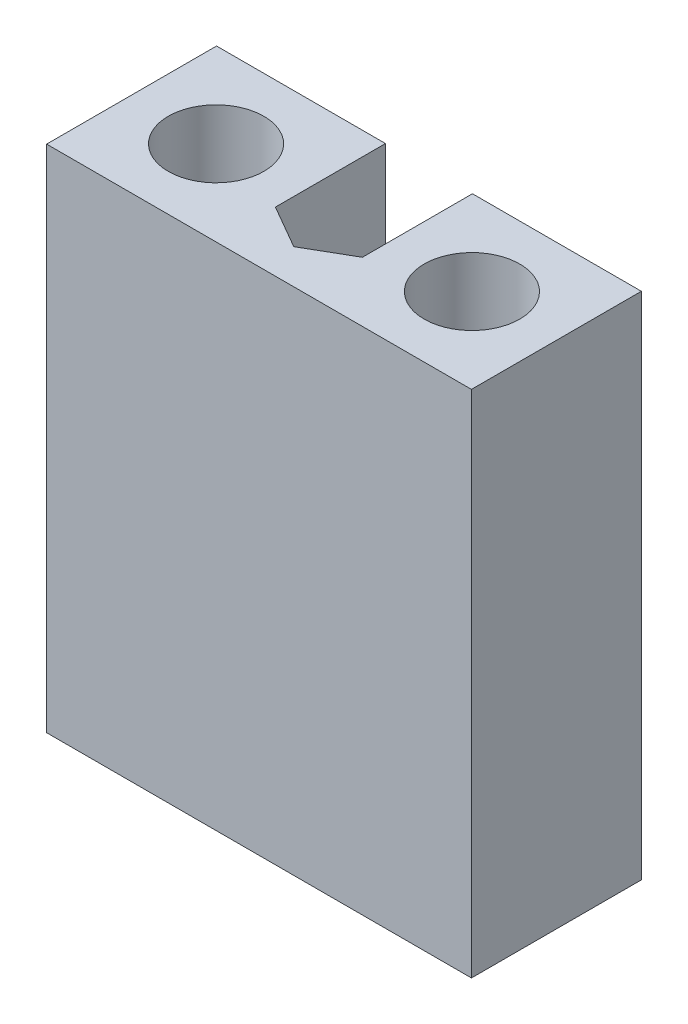
ISO-10303-21;
HEADER;
FILE_DESCRIPTION(('STEP AP214'),'2;1');
FILE_NAME('part.step','',(''),(''),'','','');
FILE_SCHEMA(('AUTOMOTIVE_DESIGN { 1 0 10303 214 1 1 1 1 }'));
ENDSEC;
DATA;
#1=APPLICATION_CONTEXT('core data for automotive mechanical design processes');
#2=APPLICATION_PROTOCOL_DEFINITION('international standard','automotive_design',2000,#1);
#3=PRODUCT_CONTEXT('',#1,'mechanical');
#4=PRODUCT('Part','Part','',(#3));
#5=PRODUCT_RELATED_PRODUCT_CATEGORY('part','',(#4));
#6=PRODUCT_DEFINITION_FORMATION('','',#4);
#7=PRODUCT_DEFINITION_CONTEXT('part definition',#1,'design');
#8=PRODUCT_DEFINITION('design','',#6,#7);
#9=PRODUCT_DEFINITION_SHAPE('','',#8);
#10=(LENGTH_UNIT() NAMED_UNIT(*) SI_UNIT(.MILLI.,.METRE.));
#11=(NAMED_UNIT(*) PLANE_ANGLE_UNIT() SI_UNIT($,.RADIAN.));
#12=(NAMED_UNIT(*) SI_UNIT($,.STERADIAN.) SOLID_ANGLE_UNIT());
#13=UNCERTAINTY_MEASURE_WITH_UNIT(LENGTH_MEASURE(1.E-05),#10,'distance_accuracy_value','');
#14=(GEOMETRIC_REPRESENTATION_CONTEXT(3) GLOBAL_UNCERTAINTY_ASSIGNED_CONTEXT((#13)) GLOBAL_UNIT_ASSIGNED_CONTEXT((#10,
#11,#12)) REPRESENTATION_CONTEXT('',''));
#15=CARTESIAN_POINT('',(0.,0.,0.));
#16=DIRECTION('',(0.,0.,1.));
#17=DIRECTION('',(1.,0.,0.));
#18=AXIS2_PLACEMENT_3D('',#15,#16,#17);
#19=CARTESIAN_POINT('',(0.,76.2,0.));
#20=DIRECTION('',(0.,-1.,0.));
#21=DIRECTION('',(0.,0.,-1.));
#22=AXIS2_PLACEMENT_3D('',#19,#20,#21);
#23=PLANE('',#22);
#24=CARTESIAN_POINT('',(19.125,76.2,0.));
#25=DIRECTION('',(0.,1.,0.));
#26=DIRECTION('',(0.,0.,1.));
#27=AXIS2_PLACEMENT_3D('',#24,#25,#26);
#28=CIRCLE('',#27,7.14375);
#29=CARTESIAN_POINT('',(19.125,76.2,7.14375));
#30=VERTEX_POINT('',#29);
#31=EDGE_CURVE('E238',#30,#30,#28,.T.);
#32=ORIENTED_EDGE('',*,*,#31,.F.);
#33=EDGE_LOOP('',(#32));
#34=FACE_BOUND('',#33,.T.);
#35=DIRECTION('',(-1.,0.,0.));
#36=VECTOR('',#35,1.);
#37=CARTESIAN_POINT('',(6.5,76.2,-12.7));
#38=LINE('',#37,#36);
#39=CARTESIAN_POINT('',(31.75,76.2,-12.7));
#40=VERTEX_POINT('',#39);
#41=CARTESIAN_POINT('',(6.5,76.2,-12.7));
#42=VERTEX_POINT('',#41);
#43=EDGE_CURVE('E174',#40,#42,#38,.T.);
#44=ORIENTED_EDGE('',*,*,#43,.T.);
#45=DIRECTION('',(0.,0.,1.));
#46=VECTOR('',#45,1.);
#47=CARTESIAN_POINT('',(6.5,76.2,-3.75277674973257));
#48=LINE('',#47,#46);
#49=CARTESIAN_POINT('',(6.5,76.2,3.75277674973257));
#50=VERTEX_POINT('',#49);
#51=EDGE_CURVE('E103',#42,#50,#48,.T.);
#52=ORIENTED_EDGE('',*,*,#51,.T.);
#53=DIRECTION('',(-0.866025403784439,0.,0.5));
#54=VECTOR('',#53,1.);
#55=CARTESIAN_POINT('',(0.,76.2,7.50555349946514));
#56=LINE('',#55,#54);
#57=CARTESIAN_POINT('',(0.,76.2,7.50555349946514));
#58=VERTEX_POINT('',#57);
#59=EDGE_CURVE('E199',#50,#58,#56,.T.);
#60=ORIENTED_EDGE('',*,*,#59,.T.);
#61=DIRECTION('',(-0.866025403784439,0.,-0.5));
#62=VECTOR('',#61,1.);
#63=CARTESIAN_POINT('',(-6.5,76.2,3.75277674973257));
#64=LINE('',#63,#62);
#65=CARTESIAN_POINT('',(-6.5,76.2,3.75277674973257));
#66=VERTEX_POINT('',#65);
#67=EDGE_CURVE('E215',#58,#66,#64,.T.);
#68=ORIENTED_EDGE('',*,*,#67,.T.);
#69=DIRECTION('',(0.,0.,-1.));
#70=VECTOR('',#69,1.);
#71=CARTESIAN_POINT('',(-6.5,76.2,-3.75277674973257));
#72=LINE('',#71,#70);
#73=CARTESIAN_POINT('',(-6.5,76.2,-12.7));
#74=VERTEX_POINT('',#73);
#75=EDGE_CURVE('E213',#66,#74,#72,.T.);
#76=ORIENTED_EDGE('',*,*,#75,.T.);
#77=DIRECTION('',(-1.,0.,0.));
#78=VECTOR('',#77,1.);
#79=CARTESIAN_POINT('',(-31.75,76.2,-12.7));
#80=LINE('',#79,#78);
#81=CARTESIAN_POINT('',(-31.75,76.2,-12.7));
#82=VERTEX_POINT('',#81);
#83=EDGE_CURVE('E125',#74,#82,#80,.T.);
#84=ORIENTED_EDGE('',*,*,#83,.T.);
#85=DIRECTION('',(0.,0.,1.));
#86=VECTOR('',#85,1.);
#87=CARTESIAN_POINT('',(-31.75,76.2,12.7));
#88=LINE('',#87,#86);
#89=CARTESIAN_POINT('',(-31.75,76.2,12.7));
#90=VERTEX_POINT('',#89);
#91=EDGE_CURVE('E119',#82,#90,#88,.T.);
#92=ORIENTED_EDGE('',*,*,#91,.T.);
#93=DIRECTION('',(1.,0.,0.));
#94=VECTOR('',#93,1.);
#95=CARTESIAN_POINT('',(31.75,76.2,12.7));
#96=LINE('',#95,#94);
#97=CARTESIAN_POINT('',(31.75,76.2,12.7));
#98=VERTEX_POINT('',#97);
#99=EDGE_CURVE('E123',#90,#98,#96,.T.);
#100=ORIENTED_EDGE('',*,*,#99,.T.);
#101=DIRECTION('',(0.,0.,-1.));
#102=VECTOR('',#101,1.);
#103=CARTESIAN_POINT('',(31.75,76.2,-12.7));
#104=LINE('',#103,#102);
#105=EDGE_CURVE('E57',#98,#40,#104,.T.);
#106=ORIENTED_EDGE('',*,*,#105,.T.);
#107=EDGE_LOOP('',(#44,#52,#60,#68,#76,#84,#92,#100,#106));
#108=FACE_BOUND('',#107,.T.);
#109=CARTESIAN_POINT('',(-19.125,76.2,0.));
#110=DIRECTION('',(0.,1.,0.));
#111=DIRECTION('',(0.,0.,1.));
#112=AXIS2_PLACEMENT_3D('',#109,#110,#111);
#113=CIRCLE('',#112,7.14375);
#114=CARTESIAN_POINT('',(-19.125,76.2,7.14375));
#115=VERTEX_POINT('',#114);
#116=EDGE_CURVE('E254',#115,#115,#113,.T.);
#117=ORIENTED_EDGE('',*,*,#116,.F.);
#118=EDGE_LOOP('',(#117));
#119=FACE_BOUND('',#118,.T.);
#120=ADVANCED_FACE('F39',(#34,#108,#119),#23,.F.);
#121=CARTESIAN_POINT('',(6.5,76.2,-12.7));
#122=DIRECTION('',(0.,0.,1.));
#123=DIRECTION('',(1.,0.,0.));
#124=AXIS2_PLACEMENT_3D('',#121,#122,#123);
#125=PLANE('',#124);
#126=DIRECTION('',(-1.,0.,0.));
#127=VECTOR('',#126,1.);
#128=CARTESIAN_POINT('',(6.5,0.,-12.7));
#129=LINE('',#128,#127);
#130=CARTESIAN_POINT('',(31.75,0.,-12.7));
#131=VERTEX_POINT('',#130);
#132=CARTESIAN_POINT('',(6.5,0.,-12.7));
#133=VERTEX_POINT('',#132);
#134=EDGE_CURVE('E147',#131,#133,#129,.T.);
#135=ORIENTED_EDGE('',*,*,#134,.T.);
#136=DIRECTION('',(0.,-1.,0.));
#137=VECTOR('',#136,1.);
#138=CARTESIAN_POINT('',(6.5,76.2,-12.7));
#139=LINE('',#138,#137);
#140=EDGE_CURVE('E11',#42,#133,#139,.T.);
#141=ORIENTED_EDGE('',*,*,#140,.F.);
#142=ORIENTED_EDGE('',*,*,#43,.F.);
#143=DIRECTION('',(0.,-1.,0.));
#144=VECTOR('',#143,1.);
#145=CARTESIAN_POINT('',(31.75,76.2,-12.7));
#146=LINE('',#145,#144);
#147=EDGE_CURVE('E143',#40,#131,#146,.T.);
#148=ORIENTED_EDGE('',*,*,#147,.T.);
#149=EDGE_LOOP('',(#135,#141,#142,#148));
#150=FACE_BOUND('',#149,.T.);
#151=ADVANCED_FACE('F41',(#150),#125,.F.);
#152=CARTESIAN_POINT('',(6.5,76.2,3.75277674973257));
#153=DIRECTION('',(1.,0.,0.));
#154=DIRECTION('',(0.,0.,-1.));
#155=AXIS2_PLACEMENT_3D('',#152,#153,#154);
#156=PLANE('',#155);
#157=DIRECTION('',(0.,0.,1.));
#158=VECTOR('',#157,1.);
#159=CARTESIAN_POINT('',(6.5,0.,3.75277674973257));
#160=LINE('',#159,#158);
#161=CARTESIAN_POINT('',(6.5,0.,3.75277674973257));
#162=VERTEX_POINT('',#161);
#163=EDGE_CURVE('E151',#133,#162,#160,.T.);
#164=ORIENTED_EDGE('',*,*,#163,.T.);
#165=DIRECTION('',(0.,-1.,0.));
#166=VECTOR('',#165,1.);
#167=CARTESIAN_POINT('',(6.5,76.2,3.75277674973257));
#168=LINE('',#167,#166);
#169=EDGE_CURVE('E49',#50,#162,#168,.T.);
#170=ORIENTED_EDGE('',*,*,#169,.F.);
#171=ORIENTED_EDGE('',*,*,#51,.F.);
#172=ORIENTED_EDGE('',*,*,#140,.T.);
#173=EDGE_LOOP('',(#164,#170,#171,#172));
#174=FACE_BOUND('',#173,.T.);
#175=ADVANCED_FACE('F266',(#174),#156,.F.);
#176=CARTESIAN_POINT('',(0.,76.2,7.50555349946514));
#177=DIRECTION('',(0.5,0.,0.866025403784439));
#178=DIRECTION('',(0.866025403784439,0.,-0.5));
#179=AXIS2_PLACEMENT_3D('',#176,#177,#178);
#180=PLANE('',#179);
#181=DIRECTION('',(-0.866025403784439,0.,0.5));
#182=VECTOR('',#181,1.);
#183=CARTESIAN_POINT('',(0.,0.,7.50555349946514));
#184=LINE('',#183,#182);
#185=CARTESIAN_POINT('',(0.,0.,7.50555349946514));
#186=VERTEX_POINT('',#185);
#187=EDGE_CURVE('E155',#162,#186,#184,.T.);
#188=ORIENTED_EDGE('',*,*,#187,.T.);
#189=DIRECTION('',(0.,-1.,0.));
#190=VECTOR('',#189,1.);
#191=CARTESIAN_POINT('',(0.,76.2,7.50555349946514));
#192=LINE('',#191,#190);
#193=EDGE_CURVE('E189',#58,#186,#192,.T.);
#194=ORIENTED_EDGE('',*,*,#193,.F.);
#195=ORIENTED_EDGE('',*,*,#59,.F.);
#196=ORIENTED_EDGE('',*,*,#169,.T.);
#197=EDGE_LOOP('',(#188,#194,#195,#196));
#198=FACE_BOUND('',#197,.T.);
#199=ADVANCED_FACE('F197',(#198),#180,.F.);
#200=CARTESIAN_POINT('',(-6.5,76.2,3.75277674973257));
#201=DIRECTION('',(-0.5,0.,0.866025403784439));
#202=DIRECTION('',(0.866025403784438,0.,0.5));
#203=AXIS2_PLACEMENT_3D('',#200,#201,#202);
#204=PLANE('',#203);
#205=DIRECTION('',(-0.866025403784439,0.,-0.5));
#206=VECTOR('',#205,1.);
#207=CARTESIAN_POINT('',(-6.5,0.,3.75277674973257));
#208=LINE('',#207,#206);
#209=CARTESIAN_POINT('',(-6.5,0.,3.75277674973257));
#210=VERTEX_POINT('',#209);
#211=EDGE_CURVE('E158',#186,#210,#208,.T.);
#212=ORIENTED_EDGE('',*,*,#211,.T.);
#213=DIRECTION('',(0.,-1.,0.));
#214=VECTOR('',#213,1.);
#215=CARTESIAN_POINT('',(-6.5,76.2,3.75277674973257));
#216=LINE('',#215,#214);
#217=EDGE_CURVE('E185',#66,#210,#216,.T.);
#218=ORIENTED_EDGE('',*,*,#217,.F.);
#219=ORIENTED_EDGE('',*,*,#67,.F.);
#220=ORIENTED_EDGE('',*,*,#193,.T.);
#221=EDGE_LOOP('',(#212,#218,#219,#220));
#222=FACE_BOUND('',#221,.T.);
#223=ADVANCED_FACE('F207',(#222),#204,.F.);
#224=CARTESIAN_POINT('',(-6.5,76.2,-12.7));
#225=DIRECTION('',(-1.,0.,0.));
#226=DIRECTION('',(0.,0.,1.));
#227=AXIS2_PLACEMENT_3D('',#224,#225,#226);
#228=PLANE('',#227);
#229=DIRECTION('',(0.,0.,-1.));
#230=VECTOR('',#229,1.);
#231=CARTESIAN_POINT('',(-6.5,0.,-12.7));
#232=LINE('',#231,#230);
#233=CARTESIAN_POINT('',(-6.5,0.,-12.7));
#234=VERTEX_POINT('',#233);
#235=EDGE_CURVE('E162',#210,#234,#232,.T.);
#236=ORIENTED_EDGE('',*,*,#235,.T.);
#237=DIRECTION('',(0.,-1.,0.));
#238=VECTOR('',#237,1.);
#239=CARTESIAN_POINT('',(-6.5,76.2,-12.7));
#240=LINE('',#239,#238);
#241=EDGE_CURVE('E181',#74,#234,#240,.T.);
#242=ORIENTED_EDGE('',*,*,#241,.F.);
#243=ORIENTED_EDGE('',*,*,#75,.F.);
#244=ORIENTED_EDGE('',*,*,#217,.T.);
#245=EDGE_LOOP('',(#236,#242,#243,#244));
#246=FACE_BOUND('',#245,.T.);
#247=ADVANCED_FACE('F211',(#246),#228,.F.);
#248=CARTESIAN_POINT('',(-31.75,76.2,-12.7));
#249=DIRECTION('',(0.,0.,1.));
#250=DIRECTION('',(1.,0.,0.));
#251=AXIS2_PLACEMENT_3D('',#248,#249,#250);
#252=PLANE('',#251);
#253=DIRECTION('',(-1.,0.,0.));
#254=VECTOR('',#253,1.);
#255=CARTESIAN_POINT('',(-31.75,0.,-12.7));
#256=LINE('',#255,#254);
#257=CARTESIAN_POINT('',(-31.75,0.,-12.7));
#258=VERTEX_POINT('',#257);
#259=EDGE_CURVE('E165',#234,#258,#256,.T.);
#260=ORIENTED_EDGE('',*,*,#259,.T.);
#261=DIRECTION('',(0.,-1.,0.));
#262=VECTOR('',#261,1.);
#263=CARTESIAN_POINT('',(-31.75,76.2,-12.7));
#264=LINE('',#263,#262);
#265=EDGE_CURVE('E136',#82,#258,#264,.T.);
#266=ORIENTED_EDGE('',*,*,#265,.F.);
#267=ORIENTED_EDGE('',*,*,#83,.F.);
#268=ORIENTED_EDGE('',*,*,#241,.T.);
#269=EDGE_LOOP('',(#260,#266,#267,#268));
#270=FACE_BOUND('',#269,.T.);
#271=ADVANCED_FACE('F283',(#270),#252,.F.);
#272=CARTESIAN_POINT('',(-31.75,76.2,12.7));
#273=DIRECTION('',(1.,0.,0.));
#274=DIRECTION('',(0.,0.,-1.));
#275=AXIS2_PLACEMENT_3D('',#272,#273,#274);
#276=PLANE('',#275);
#277=DIRECTION('',(0.,0.,1.));
#278=VECTOR('',#277,1.);
#279=CARTESIAN_POINT('',(-31.75,0.,12.7));
#280=LINE('',#279,#278);
#281=CARTESIAN_POINT('',(-31.75,0.,12.7));
#282=VERTEX_POINT('',#281);
#283=EDGE_CURVE('E134',#258,#282,#280,.T.);
#284=ORIENTED_EDGE('',*,*,#283,.T.);
#285=DIRECTION('',(0.,-1.,0.));
#286=VECTOR('',#285,1.);
#287=CARTESIAN_POINT('',(-31.75,76.2,12.7));
#288=LINE('',#287,#286);
#289=EDGE_CURVE('E131',#90,#282,#288,.T.);
#290=ORIENTED_EDGE('',*,*,#289,.F.);
#291=ORIENTED_EDGE('',*,*,#91,.F.);
#292=ORIENTED_EDGE('',*,*,#265,.T.);
#293=EDGE_LOOP('',(#284,#290,#291,#292));
#294=FACE_BOUND('',#293,.T.);
#295=ADVANCED_FACE('F132',(#294),#276,.F.);
#296=CARTESIAN_POINT('',(31.75,76.2,12.7));
#297=DIRECTION('',(0.,0.,-1.));
#298=DIRECTION('',(-1.,0.,0.));
#299=AXIS2_PLACEMENT_3D('',#296,#297,#298);
#300=PLANE('',#299);
#301=DIRECTION('',(1.,0.,0.));
#302=VECTOR('',#301,1.);
#303=CARTESIAN_POINT('',(31.75,0.,12.7));
#304=LINE('',#303,#302);
#305=CARTESIAN_POINT('',(31.75,0.,12.7));
#306=VERTEX_POINT('',#305);
#307=EDGE_CURVE('E89',#282,#306,#304,.T.);
#308=ORIENTED_EDGE('',*,*,#307,.T.);
#309=DIRECTION('',(0.,-1.,0.));
#310=VECTOR('',#309,1.);
#311=CARTESIAN_POINT('',(31.75,76.2,12.7));
#312=LINE('',#311,#310);
#313=EDGE_CURVE('E137',#98,#306,#312,.T.);
#314=ORIENTED_EDGE('',*,*,#313,.F.);
#315=ORIENTED_EDGE('',*,*,#99,.F.);
#316=ORIENTED_EDGE('',*,*,#289,.T.);
#317=EDGE_LOOP('',(#308,#314,#315,#316));
#318=FACE_BOUND('',#317,.T.);
#319=ADVANCED_FACE('F139',(#318),#300,.F.);
#320=CARTESIAN_POINT('',(31.75,76.2,-12.7));
#321=DIRECTION('',(-1.,0.,0.));
#322=DIRECTION('',(0.,0.,1.));
#323=AXIS2_PLACEMENT_3D('',#320,#321,#322);
#324=PLANE('',#323);
#325=DIRECTION('',(0.,0.,-1.));
#326=VECTOR('',#325,1.);
#327=CARTESIAN_POINT('',(31.75,0.,-12.7));
#328=LINE('',#327,#326);
#329=EDGE_CURVE('E95',#306,#131,#328,.T.);
#330=ORIENTED_EDGE('',*,*,#329,.T.);
#331=ORIENTED_EDGE('',*,*,#147,.F.);
#332=ORIENTED_EDGE('',*,*,#105,.F.);
#333=ORIENTED_EDGE('',*,*,#313,.T.);
#334=EDGE_LOOP('',(#330,#331,#332,#333));
#335=FACE_BOUND('',#334,.T.);
#336=ADVANCED_FACE('F275',(#335),#324,.F.);
#337=CARTESIAN_POINT('',(0.,0.,0.));
#338=DIRECTION('',(0.,-1.,0.));
#339=DIRECTION('',(0.,0.,-1.));
#340=AXIS2_PLACEMENT_3D('',#337,#338,#339);
#341=PLANE('',#340);
#342=CARTESIAN_POINT('',(-19.125,0.,0.));
#343=DIRECTION('',(0.,1.,0.));
#344=DIRECTION('',(0.,0.,1.));
#345=AXIS2_PLACEMENT_3D('',#342,#343,#344);
#346=CIRCLE('',#345,3.37819999999998);
#347=CARTESIAN_POINT('',(-19.125,0.,3.37819999999998));
#348=VERTEX_POINT('',#347);
#349=EDGE_CURVE('E242',#348,#348,#346,.T.);
#350=ORIENTED_EDGE('',*,*,#349,.T.);
#351=EDGE_LOOP('',(#350));
#352=FACE_BOUND('',#351,.T.);
#353=CARTESIAN_POINT('',(19.125,0.,0.));
#354=DIRECTION('',(0.,1.,0.));
#355=DIRECTION('',(0.,0.,1.));
#356=AXIS2_PLACEMENT_3D('',#353,#354,#355);
#357=CIRCLE('',#356,3.37819999999998);
#358=CARTESIAN_POINT('',(19.125,0.,3.37819999999998));
#359=VERTEX_POINT('',#358);
#360=EDGE_CURVE('E152',#359,#359,#357,.T.);
#361=ORIENTED_EDGE('',*,*,#360,.T.);
#362=EDGE_LOOP('',(#361));
#363=FACE_BOUND('',#362,.T.);
#364=ORIENTED_EDGE('',*,*,#134,.F.);
#365=ORIENTED_EDGE('',*,*,#329,.F.);
#366=ORIENTED_EDGE('',*,*,#307,.F.);
#367=ORIENTED_EDGE('',*,*,#283,.F.);
#368=ORIENTED_EDGE('',*,*,#259,.F.);
#369=ORIENTED_EDGE('',*,*,#235,.F.);
#370=ORIENTED_EDGE('',*,*,#211,.F.);
#371=ORIENTED_EDGE('',*,*,#187,.F.);
#372=ORIENTED_EDGE('',*,*,#163,.F.);
#373=EDGE_LOOP('',(#364,#365,#366,#367,#368,#369,#370,#371,#372));
#374=FACE_BOUND('',#373,.T.);
#375=ADVANCED_FACE('F203',(#352,#363,#374),#341,.T.);
#376=CARTESIAN_POINT('',(19.125,76.2,0.));
#377=DIRECTION('',(0.,1.,0.));
#378=DIRECTION('',(0.,0.,1.));
#379=AXIS2_PLACEMENT_3D('',#376,#377,#378);
#380=CYLINDRICAL_SURFACE('',#379,3.37819999999999);
#381=ORIENTED_EDGE('',*,*,#360,.F.);
#382=EDGE_LOOP('',(#381));
#383=FACE_BOUND('',#382,.T.);
#384=CARTESIAN_POINT('',(19.125,21.209,0.));
#385=DIRECTION('',(0.,1.,0.));
#386=DIRECTION('',(0.,0.,1.));
#387=AXIS2_PLACEMENT_3D('',#384,#385,#386);
#388=CIRCLE('',#387,3.37819999999999);
#389=CARTESIAN_POINT('',(19.125,21.209,3.37819999999999));
#390=VERTEX_POINT('',#389);
#391=EDGE_CURVE('E230',#390,#390,#388,.T.);
#392=ORIENTED_EDGE('',*,*,#391,.T.);
#393=EDGE_LOOP('',(#392));
#394=FACE_BOUND('',#393,.T.);
#395=ADVANCED_FACE('F271',(#383,#394),#380,.F.);
#396=CARTESIAN_POINT('',(22.5032,21.209,0.));
#397=DIRECTION('',(0.,-1.,0.));
#398=DIRECTION('',(0.,0.,-1.));
#399=AXIS2_PLACEMENT_3D('',#396,#397,#398);
#400=PLANE('',#399);
#401=ORIENTED_EDGE('',*,*,#391,.F.);
#402=EDGE_LOOP('',(#401));
#403=FACE_BOUND('',#402,.T.);
#404=CARTESIAN_POINT('',(19.125,21.209,0.));
#405=DIRECTION('',(0.,1.,0.));
#406=DIRECTION('',(0.,0.,1.));
#407=AXIS2_PLACEMENT_3D('',#404,#405,#406);
#408=CIRCLE('',#407,7.14374999999999);
#409=CARTESIAN_POINT('',(19.125,21.209,7.14374999999999));
#410=VERTEX_POINT('',#409);
#411=EDGE_CURVE('E234',#410,#410,#408,.T.);
#412=ORIENTED_EDGE('',*,*,#411,.T.);
#413=EDGE_LOOP('',(#412));
#414=FACE_BOUND('',#413,.T.);
#415=ADVANCED_FACE('F337',(#403,#414),#400,.F.);
#416=CARTESIAN_POINT('',(19.125,76.2,0.));
#417=DIRECTION('',(0.,1.,0.));
#418=DIRECTION('',(0.,0.,1.));
#419=AXIS2_PLACEMENT_3D('',#416,#417,#418);
#420=CYLINDRICAL_SURFACE('',#419,7.14374999999999);
#421=ORIENTED_EDGE('',*,*,#411,.F.);
#422=EDGE_LOOP('',(#421));
#423=FACE_BOUND('',#422,.T.);
#424=ORIENTED_EDGE('',*,*,#31,.T.);
#425=EDGE_LOOP('',(#424));
#426=FACE_BOUND('',#425,.T.);
#427=ADVANCED_FACE('F344',(#423,#426),#420,.F.);
#428=CARTESIAN_POINT('',(-19.125,76.2,0.));
#429=DIRECTION('',(0.,1.,0.));
#430=DIRECTION('',(0.,0.,1.));
#431=AXIS2_PLACEMENT_3D('',#428,#429,#430);
#432=CYLINDRICAL_SURFACE('',#431,3.37819999999999);
#433=ORIENTED_EDGE('',*,*,#349,.F.);
#434=EDGE_LOOP('',(#433));
#435=FACE_BOUND('',#434,.T.);
#436=CARTESIAN_POINT('',(-19.125,21.209,0.));
#437=DIRECTION('',(0.,1.,0.));
#438=DIRECTION('',(0.,0.,1.));
#439=AXIS2_PLACEMENT_3D('',#436,#437,#438);
#440=CIRCLE('',#439,3.37819999999999);
#441=CARTESIAN_POINT('',(-19.125,21.209,3.37819999999999));
#442=VERTEX_POINT('',#441);
#443=EDGE_CURVE('E246',#442,#442,#440,.T.);
#444=ORIENTED_EDGE('',*,*,#443,.T.);
#445=EDGE_LOOP('',(#444));
#446=FACE_BOUND('',#445,.T.);
#447=ADVANCED_FACE('F351',(#435,#446),#432,.F.);
#448=CARTESIAN_POINT('',(-15.7468,21.209,0.));
#449=DIRECTION('',(0.,-1.,0.));
#450=DIRECTION('',(0.,0.,-1.));
#451=AXIS2_PLACEMENT_3D('',#448,#449,#450);
#452=PLANE('',#451);
#453=ORIENTED_EDGE('',*,*,#443,.F.);
#454=EDGE_LOOP('',(#453));
#455=FACE_BOUND('',#454,.T.);
#456=CARTESIAN_POINT('',(-19.125,21.209,0.));
#457=DIRECTION('',(0.,1.,0.));
#458=DIRECTION('',(0.,0.,1.));
#459=AXIS2_PLACEMENT_3D('',#456,#457,#458);
#460=CIRCLE('',#459,7.14374999999999);
#461=CARTESIAN_POINT('',(-19.125,21.209,7.14374999999999));
#462=VERTEX_POINT('',#461);
#463=EDGE_CURVE('E250',#462,#462,#460,.T.);
#464=ORIENTED_EDGE('',*,*,#463,.T.);
#465=EDGE_LOOP('',(#464));
#466=FACE_BOUND('',#465,.T.);
#467=ADVANCED_FACE('F359',(#455,#466),#452,.F.);
#468=CARTESIAN_POINT('',(-19.125,76.2,0.));
#469=DIRECTION('',(0.,1.,0.));
#470=DIRECTION('',(0.,0.,1.));
#471=AXIS2_PLACEMENT_3D('',#468,#469,#470);
#472=CYLINDRICAL_SURFACE('',#471,7.14374999999999);
#473=ORIENTED_EDGE('',*,*,#463,.F.);
#474=EDGE_LOOP('',(#473));
#475=FACE_BOUND('',#474,.T.);
#476=ORIENTED_EDGE('',*,*,#116,.T.);
#477=EDGE_LOOP('',(#476));
#478=FACE_BOUND('',#477,.T.);
#479=ADVANCED_FACE('F259',(#475,#478),#472,.F.);
#480=CLOSED_SHELL('',(#120,#151,#175,#199,#223,#247,#271,#295,#319,#336,#375,#395,#415,#427,
#447,#467,#479));
#481=MANIFOLD_SOLID_BREP('B2',#480);
#482=ADVANCED_BREP_SHAPE_REPRESENTATION('',(#18,#481),#14);
#483=SHAPE_DEFINITION_REPRESENTATION(#9,#482);
ENDSEC;
END-ISO-10303-21;
